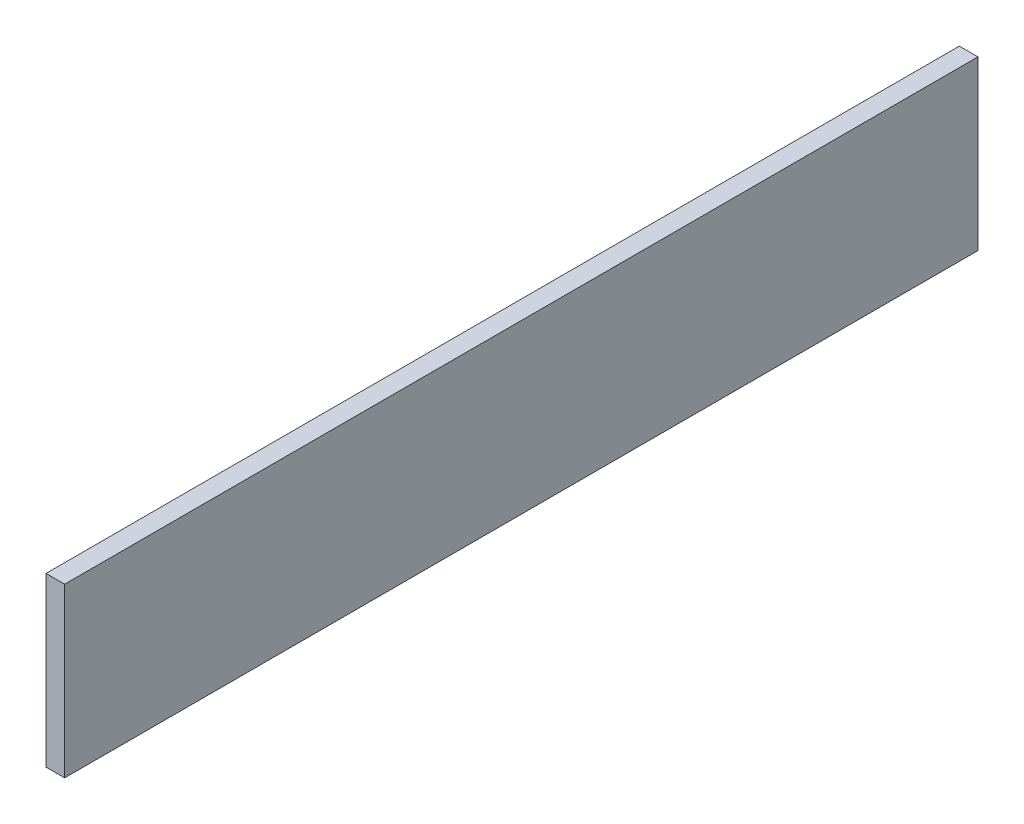
ISO-10303-21;
HEADER;
FILE_DESCRIPTION(('STEP AP214'),'2;1');
FILE_NAME('part.step','',(''),(''),'','','');
FILE_SCHEMA(('AUTOMOTIVE_DESIGN { 1 0 10303 214 1 1 1 1 }'));
ENDSEC;
DATA;
#1=APPLICATION_CONTEXT('core data for automotive mechanical design processes');
#2=APPLICATION_PROTOCOL_DEFINITION('international standard','automotive_design',2000,#1);
#3=PRODUCT_CONTEXT('',#1,'mechanical');
#4=PRODUCT('Part','Part','',(#3));
#5=PRODUCT_RELATED_PRODUCT_CATEGORY('part','',(#4));
#6=PRODUCT_DEFINITION_FORMATION('','',#4);
#7=PRODUCT_DEFINITION_CONTEXT('part definition',#1,'design');
#8=PRODUCT_DEFINITION('design','',#6,#7);
#9=PRODUCT_DEFINITION_SHAPE('','',#8);
#10=(LENGTH_UNIT() NAMED_UNIT(*) SI_UNIT(.MILLI.,.METRE.));
#11=(NAMED_UNIT(*) PLANE_ANGLE_UNIT() SI_UNIT($,.RADIAN.));
#12=(NAMED_UNIT(*) SI_UNIT($,.STERADIAN.) SOLID_ANGLE_UNIT());
#13=UNCERTAINTY_MEASURE_WITH_UNIT(LENGTH_MEASURE(1.E-05),#10,'distance_accuracy_value','');
#14=(GEOMETRIC_REPRESENTATION_CONTEXT(3) GLOBAL_UNCERTAINTY_ASSIGNED_CONTEXT((#13)) GLOBAL_UNIT_ASSIGNED_CONTEXT((#10,
#11,#12)) REPRESENTATION_CONTEXT('',''));
#15=CARTESIAN_POINT('',(0.,0.,0.));
#16=DIRECTION('',(0.,0.,1.));
#17=DIRECTION('',(1.,0.,0.));
#18=AXIS2_PLACEMENT_3D('',#15,#16,#17);
#19=CARTESIAN_POINT('',(12.7,0.,0.));
#20=DIRECTION('',(0.,0.,-1.));
#21=DIRECTION('',(-1.,0.,0.));
#22=AXIS2_PLACEMENT_3D('',#19,#20,#21);
#23=PLANE('',#22);
#24=DIRECTION('',(0.,-1.,0.));
#25=VECTOR('',#24,1.);
#26=CARTESIAN_POINT('',(0.,0.,0.));
#27=LINE('',#26,#25);
#28=CARTESIAN_POINT('',(0.,114.3,0.));
#29=VERTEX_POINT('',#28);
#30=CARTESIAN_POINT('',(0.,0.,0.));
#31=VERTEX_POINT('',#30);
#32=EDGE_CURVE('E107',#29,#31,#27,.T.);
#33=ORIENTED_EDGE('',*,*,#32,.T.);
#34=DIRECTION('',(-1.,0.,0.));
#35=VECTOR('',#34,1.);
#36=CARTESIAN_POINT('',(12.7,0.,0.));
#37=LINE('',#36,#35);
#38=CARTESIAN_POINT('',(12.7,0.,0.));
#39=VERTEX_POINT('',#38);
#40=EDGE_CURVE('E11',#39,#31,#37,.T.);
#41=ORIENTED_EDGE('',*,*,#40,.F.);
#42=DIRECTION('',(0.,-1.,0.));
#43=VECTOR('',#42,1.);
#44=CARTESIAN_POINT('',(12.7,0.,0.));
#45=LINE('',#44,#43);
#46=CARTESIAN_POINT('',(12.7,114.3,0.));
#47=VERTEX_POINT('',#46);
#48=EDGE_CURVE('E91',#47,#39,#45,.T.);
#49=ORIENTED_EDGE('',*,*,#48,.F.);
#50=DIRECTION('',(-1.,0.,0.));
#51=VECTOR('',#50,1.);
#52=CARTESIAN_POINT('',(12.7,114.3,0.));
#53=LINE('',#52,#51);
#54=EDGE_CURVE('E103',#47,#29,#53,.T.);
#55=ORIENTED_EDGE('',*,*,#54,.T.);
#56=EDGE_LOOP('',(#33,#41,#49,#55));
#57=FACE_BOUND('',#56,.T.);
#58=ADVANCED_FACE('F39',(#57),#23,.F.);
#59=CARTESIAN_POINT('',(12.7,0.,0.));
#60=DIRECTION('',(0.,1.,0.));
#61=DIRECTION('',(0.,0.,1.));
#62=AXIS2_PLACEMENT_3D('',#59,#60,#61);
#63=PLANE('',#62);
#64=DIRECTION('',(0.,0.,-1.));
#65=VECTOR('',#64,1.);
#66=CARTESIAN_POINT('',(0.,0.,0.));
#67=LINE('',#66,#65);
#68=CARTESIAN_POINT('',(0.,0.,-622.3));
#69=VERTEX_POINT('',#68);
#70=EDGE_CURVE('E96',#31,#69,#67,.T.);
#71=ORIENTED_EDGE('',*,*,#70,.T.);
#72=DIRECTION('',(-1.,0.,0.));
#73=VECTOR('',#72,1.);
#74=CARTESIAN_POINT('',(12.7,0.,-622.3));
#75=LINE('',#74,#73);
#76=CARTESIAN_POINT('',(12.7,0.,-622.3));
#77=VERTEX_POINT('',#76);
#78=EDGE_CURVE('E48',#77,#69,#75,.T.);
#79=ORIENTED_EDGE('',*,*,#78,.F.);
#80=DIRECTION('',(0.,0.,-1.));
#81=VECTOR('',#80,1.);
#82=CARTESIAN_POINT('',(12.7,0.,0.));
#83=LINE('',#82,#81);
#84=EDGE_CURVE('E86',#39,#77,#83,.T.);
#85=ORIENTED_EDGE('',*,*,#84,.F.);
#86=ORIENTED_EDGE('',*,*,#40,.T.);
#87=EDGE_LOOP('',(#71,#79,#85,#86));
#88=FACE_BOUND('',#87,.T.);
#89=ADVANCED_FACE('F95',(#88),#63,.F.);
#90=CARTESIAN_POINT('',(12.7,0.,-622.3));
#91=DIRECTION('',(0.,0.,1.));
#92=DIRECTION('',(1.,0.,0.));
#93=AXIS2_PLACEMENT_3D('',#90,#91,#92);
#94=PLANE('',#93);
#95=DIRECTION('',(0.,1.,0.));
#96=VECTOR('',#95,1.);
#97=CARTESIAN_POINT('',(0.,0.,-622.3));
#98=LINE('',#97,#96);
#99=CARTESIAN_POINT('',(0.,114.3,-622.3));
#100=VERTEX_POINT('',#99);
#101=EDGE_CURVE('E73',#69,#100,#98,.T.);
#102=ORIENTED_EDGE('',*,*,#101,.T.);
#103=DIRECTION('',(-1.,0.,0.));
#104=VECTOR('',#103,1.);
#105=CARTESIAN_POINT('',(12.7,114.3,-622.3));
#106=LINE('',#105,#104);
#107=CARTESIAN_POINT('',(12.7,114.3,-622.3));
#108=VERTEX_POINT('',#107);
#109=EDGE_CURVE('E98',#108,#100,#106,.T.);
#110=ORIENTED_EDGE('',*,*,#109,.F.);
#111=DIRECTION('',(0.,1.,0.));
#112=VECTOR('',#111,1.);
#113=CARTESIAN_POINT('',(12.7,0.,-622.3));
#114=LINE('',#113,#112);
#115=EDGE_CURVE('E89',#77,#108,#114,.T.);
#116=ORIENTED_EDGE('',*,*,#115,.F.);
#117=ORIENTED_EDGE('',*,*,#78,.T.);
#118=EDGE_LOOP('',(#102,#110,#116,#117));
#119=FACE_BOUND('',#118,.T.);
#120=ADVANCED_FACE('F99',(#119),#94,.F.);
#121=CARTESIAN_POINT('',(12.7,114.3,0.));
#122=DIRECTION('',(0.,-1.,0.));
#123=DIRECTION('',(0.,0.,-1.));
#124=AXIS2_PLACEMENT_3D('',#121,#122,#123);
#125=PLANE('',#124);
#126=DIRECTION('',(0.,0.,1.));
#127=VECTOR('',#126,1.);
#128=CARTESIAN_POINT('',(0.,114.3,0.));
#129=LINE('',#128,#127);
#130=EDGE_CURVE('E79',#100,#29,#129,.T.);
#131=ORIENTED_EDGE('',*,*,#130,.T.);
#132=ORIENTED_EDGE('',*,*,#54,.F.);
#133=DIRECTION('',(0.,0.,1.));
#134=VECTOR('',#133,1.);
#135=CARTESIAN_POINT('',(12.7,114.3,0.));
#136=LINE('',#135,#134);
#137=EDGE_CURVE('E56',#108,#47,#136,.T.);
#138=ORIENTED_EDGE('',*,*,#137,.F.);
#139=ORIENTED_EDGE('',*,*,#109,.T.);
#140=EDGE_LOOP('',(#131,#132,#138,#139));
#141=FACE_BOUND('',#140,.T.);
#142=ADVANCED_FACE('F120',(#141),#125,.F.);
#143=CARTESIAN_POINT('',(12.7,0.,0.));
#144=DIRECTION('',(-1.,0.,0.));
#145=DIRECTION('',(0.,0.,1.));
#146=AXIS2_PLACEMENT_3D('',#143,#144,#145);
#147=PLANE('',#146);
#148=ORIENTED_EDGE('',*,*,#48,.T.);
#149=ORIENTED_EDGE('',*,*,#84,.T.);
#150=ORIENTED_EDGE('',*,*,#115,.T.);
#151=ORIENTED_EDGE('',*,*,#137,.T.);
#152=EDGE_LOOP('',(#148,#149,#150,#151));
#153=FACE_BOUND('',#152,.T.);
#154=ADVANCED_FACE('F87',(#153),#147,.F.);
#155=CARTESIAN_POINT('',(0.,0.,0.));
#156=DIRECTION('',(-1.,0.,0.));
#157=DIRECTION('',(0.,0.,1.));
#158=AXIS2_PLACEMENT_3D('',#155,#156,#157);
#159=PLANE('',#158);
#160=ORIENTED_EDGE('',*,*,#32,.F.);
#161=ORIENTED_EDGE('',*,*,#130,.F.);
#162=ORIENTED_EDGE('',*,*,#101,.F.);
#163=ORIENTED_EDGE('',*,*,#70,.F.);
#164=EDGE_LOOP('',(#160,#161,#162,#163));
#165=FACE_BOUND('',#164,.T.);
#166=ADVANCED_FACE('F123',(#165),#159,.T.);
#167=CLOSED_SHELL('',(#58,#89,#120,#142,#154,#166));
#168=MANIFOLD_SOLID_BREP('B2',#167);
#169=ADVANCED_BREP_SHAPE_REPRESENTATION('',(#18,#168),#14);
#170=SHAPE_DEFINITION_REPRESENTATION(#9,#169);
ENDSEC;
END-ISO-10303-21;
